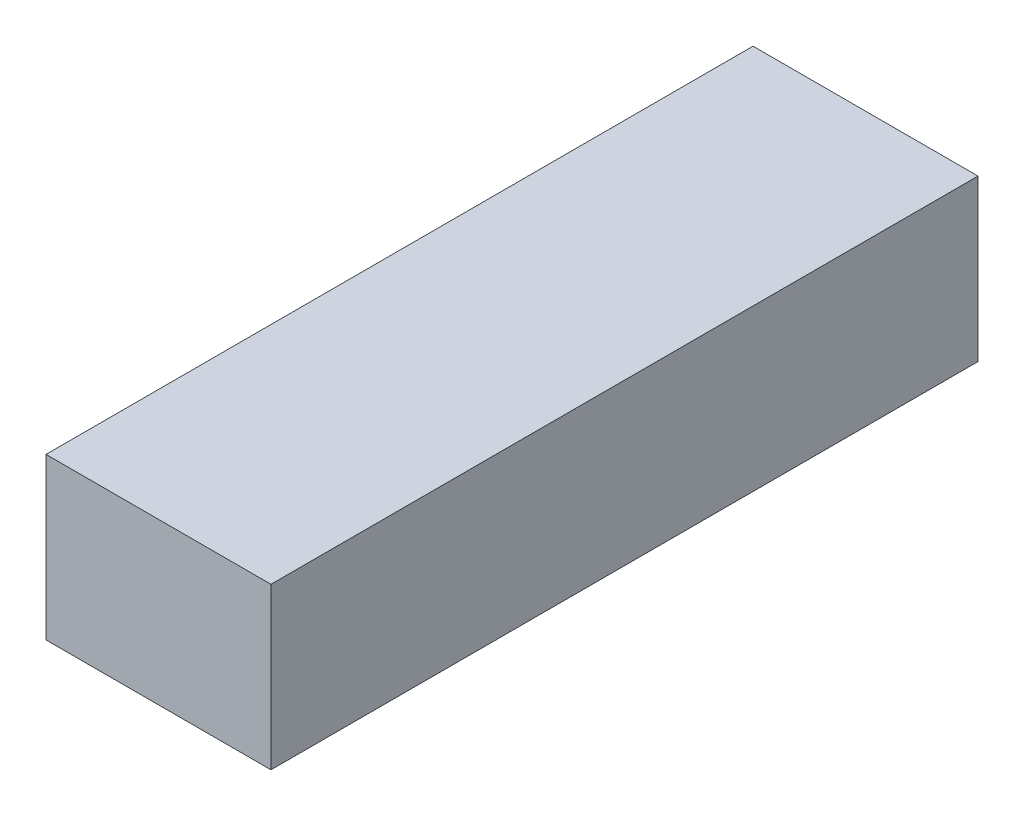
ISO-10303-21;
HEADER;
FILE_DESCRIPTION(('STEP AP214'),'2;1');
FILE_NAME('part.step','',(''),(''),'','','');
FILE_SCHEMA(('AUTOMOTIVE_DESIGN { 1 0 10303 214 1 1 1 1 }'));
ENDSEC;
DATA;
#1=APPLICATION_CONTEXT('core data for automotive mechanical design processes');
#2=APPLICATION_PROTOCOL_DEFINITION('international standard','automotive_design',2000,#1);
#3=PRODUCT_CONTEXT('',#1,'mechanical');
#4=PRODUCT('Part','Part','',(#3));
#5=PRODUCT_RELATED_PRODUCT_CATEGORY('part','',(#4));
#6=PRODUCT_DEFINITION_FORMATION('','',#4);
#7=PRODUCT_DEFINITION_CONTEXT('part definition',#1,'design');
#8=PRODUCT_DEFINITION('design','',#6,#7);
#9=PRODUCT_DEFINITION_SHAPE('','',#8);
#10=(LENGTH_UNIT() NAMED_UNIT(*) SI_UNIT(.MILLI.,.METRE.));
#11=(NAMED_UNIT(*) PLANE_ANGLE_UNIT() SI_UNIT($,.RADIAN.));
#12=(NAMED_UNIT(*) SI_UNIT($,.STERADIAN.) SOLID_ANGLE_UNIT());
#13=UNCERTAINTY_MEASURE_WITH_UNIT(LENGTH_MEASURE(1.E-05),#10,'distance_accuracy_value','');
#14=(GEOMETRIC_REPRESENTATION_CONTEXT(3) GLOBAL_UNCERTAINTY_ASSIGNED_CONTEXT((#13)) GLOBAL_UNIT_ASSIGNED_CONTEXT((#10,
#11,#12)) REPRESENTATION_CONTEXT('',''));
#15=CARTESIAN_POINT('',(0.,0.,0.));
#16=DIRECTION('',(0.,0.,1.));
#17=DIRECTION('',(1.,0.,0.));
#18=AXIS2_PLACEMENT_3D('',#15,#16,#17);
#19=CARTESIAN_POINT('',(-22.225,31.75,-69.85));
#20=DIRECTION('',(1.,0.,0.));
#21=DIRECTION('',(0.,0.,-1.));
#22=AXIS2_PLACEMENT_3D('',#19,#20,#21);
#23=PLANE('',#22);
#24=DIRECTION('',(0.,0.,1.));
#25=VECTOR('',#24,1.);
#26=CARTESIAN_POINT('',(-22.225,0.,-69.85));
#27=LINE('',#26,#25);
#28=CARTESIAN_POINT('',(-22.225,0.,-69.85));
#29=VERTEX_POINT('',#28);
#30=CARTESIAN_POINT('',(-22.225,0.,69.85));
#31=VERTEX_POINT('',#30);
#32=EDGE_CURVE('E107',#29,#31,#27,.T.);
#33=ORIENTED_EDGE('',*,*,#32,.T.);
#34=DIRECTION('',(0.,-1.,0.));
#35=VECTOR('',#34,1.);
#36=CARTESIAN_POINT('',(-22.225,31.75,69.85));
#37=LINE('',#36,#35);
#38=CARTESIAN_POINT('',(-22.225,31.75,69.85));
#39=VERTEX_POINT('',#38);
#40=EDGE_CURVE('E11',#39,#31,#37,.T.);
#41=ORIENTED_EDGE('',*,*,#40,.F.);
#42=DIRECTION('',(0.,0.,1.));
#43=VECTOR('',#42,1.);
#44=CARTESIAN_POINT('',(-22.225,31.75,-69.85));
#45=LINE('',#44,#43);
#46=CARTESIAN_POINT('',(-22.225,31.75,-69.85));
#47=VERTEX_POINT('',#46);
#48=EDGE_CURVE('E91',#47,#39,#45,.T.);
#49=ORIENTED_EDGE('',*,*,#48,.F.);
#50=DIRECTION('',(0.,-1.,0.));
#51=VECTOR('',#50,1.);
#52=CARTESIAN_POINT('',(-22.225,31.75,-69.85));
#53=LINE('',#52,#51);
#54=EDGE_CURVE('E103',#47,#29,#53,.T.);
#55=ORIENTED_EDGE('',*,*,#54,.T.);
#56=EDGE_LOOP('',(#33,#41,#49,#55));
#57=FACE_BOUND('',#56,.T.);
#58=ADVANCED_FACE('F39',(#57),#23,.F.);
#59=CARTESIAN_POINT('',(-22.225,31.75,69.85));
#60=DIRECTION('',(0.,0.,-1.));
#61=DIRECTION('',(-1.,0.,0.));
#62=AXIS2_PLACEMENT_3D('',#59,#60,#61);
#63=PLANE('',#62);
#64=DIRECTION('',(1.,0.,0.));
#65=VECTOR('',#64,1.);
#66=CARTESIAN_POINT('',(-22.225,0.,69.85));
#67=LINE('',#66,#65);
#68=CARTESIAN_POINT('',(22.225,0.,69.85));
#69=VERTEX_POINT('',#68);
#70=EDGE_CURVE('E96',#31,#69,#67,.T.);
#71=ORIENTED_EDGE('',*,*,#70,.T.);
#72=DIRECTION('',(0.,-1.,0.));
#73=VECTOR('',#72,1.);
#74=CARTESIAN_POINT('',(22.225,31.75,69.85));
#75=LINE('',#74,#73);
#76=CARTESIAN_POINT('',(22.225,31.75,69.85));
#77=VERTEX_POINT('',#76);
#78=EDGE_CURVE('E48',#77,#69,#75,.T.);
#79=ORIENTED_EDGE('',*,*,#78,.F.);
#80=DIRECTION('',(1.,0.,0.));
#81=VECTOR('',#80,1.);
#82=CARTESIAN_POINT('',(-22.225,31.75,69.85));
#83=LINE('',#82,#81);
#84=EDGE_CURVE('E86',#39,#77,#83,.T.);
#85=ORIENTED_EDGE('',*,*,#84,.F.);
#86=ORIENTED_EDGE('',*,*,#40,.T.);
#87=EDGE_LOOP('',(#71,#79,#85,#86));
#88=FACE_BOUND('',#87,.T.);
#89=ADVANCED_FACE('F95',(#88),#63,.F.);
#90=CARTESIAN_POINT('',(22.225,31.75,-69.85));
#91=DIRECTION('',(-1.,0.,0.));
#92=DIRECTION('',(0.,0.,1.));
#93=AXIS2_PLACEMENT_3D('',#90,#91,#92);
#94=PLANE('',#93);
#95=DIRECTION('',(0.,0.,-1.));
#96=VECTOR('',#95,1.);
#97=CARTESIAN_POINT('',(22.225,0.,-69.85));
#98=LINE('',#97,#96);
#99=CARTESIAN_POINT('',(22.225,0.,-69.85));
#100=VERTEX_POINT('',#99);
#101=EDGE_CURVE('E73',#69,#100,#98,.T.);
#102=ORIENTED_EDGE('',*,*,#101,.T.);
#103=DIRECTION('',(0.,-1.,0.));
#104=VECTOR('',#103,1.);
#105=CARTESIAN_POINT('',(22.225,31.75,-69.85));
#106=LINE('',#105,#104);
#107=CARTESIAN_POINT('',(22.225,31.75,-69.85));
#108=VERTEX_POINT('',#107);
#109=EDGE_CURVE('E98',#108,#100,#106,.T.);
#110=ORIENTED_EDGE('',*,*,#109,.F.);
#111=DIRECTION('',(0.,0.,-1.));
#112=VECTOR('',#111,1.);
#113=CARTESIAN_POINT('',(22.225,31.75,-69.85));
#114=LINE('',#113,#112);
#115=EDGE_CURVE('E89',#77,#108,#114,.T.);
#116=ORIENTED_EDGE('',*,*,#115,.F.);
#117=ORIENTED_EDGE('',*,*,#78,.T.);
#118=EDGE_LOOP('',(#102,#110,#116,#117));
#119=FACE_BOUND('',#118,.T.);
#120=ADVANCED_FACE('F99',(#119),#94,.F.);
#121=CARTESIAN_POINT('',(-22.225,31.75,-69.85));
#122=DIRECTION('',(0.,0.,1.));
#123=DIRECTION('',(1.,0.,0.));
#124=AXIS2_PLACEMENT_3D('',#121,#122,#123);
#125=PLANE('',#124);
#126=DIRECTION('',(-1.,0.,0.));
#127=VECTOR('',#126,1.);
#128=CARTESIAN_POINT('',(-22.225,0.,-69.85));
#129=LINE('',#128,#127);
#130=EDGE_CURVE('E79',#100,#29,#129,.T.);
#131=ORIENTED_EDGE('',*,*,#130,.T.);
#132=ORIENTED_EDGE('',*,*,#54,.F.);
#133=DIRECTION('',(-1.,0.,0.));
#134=VECTOR('',#133,1.);
#135=CARTESIAN_POINT('',(-22.225,31.75,-69.85));
#136=LINE('',#135,#134);
#137=EDGE_CURVE('E56',#108,#47,#136,.T.);
#138=ORIENTED_EDGE('',*,*,#137,.F.);
#139=ORIENTED_EDGE('',*,*,#109,.T.);
#140=EDGE_LOOP('',(#131,#132,#138,#139));
#141=FACE_BOUND('',#140,.T.);
#142=ADVANCED_FACE('F120',(#141),#125,.F.);
#143=CARTESIAN_POINT('',(0.,31.75,0.));
#144=DIRECTION('',(0.,1.,0.));
#145=DIRECTION('',(0.,0.,1.));
#146=AXIS2_PLACEMENT_3D('',#143,#144,#145);
#147=PLANE('',#146);
#148=ORIENTED_EDGE('',*,*,#48,.T.);
#149=ORIENTED_EDGE('',*,*,#84,.T.);
#150=ORIENTED_EDGE('',*,*,#115,.T.);
#151=ORIENTED_EDGE('',*,*,#137,.T.);
#152=EDGE_LOOP('',(#148,#149,#150,#151));
#153=FACE_BOUND('',#152,.T.);
#154=ADVANCED_FACE('F87',(#153),#147,.T.);
#155=CARTESIAN_POINT('',(0.,0.,0.));
#156=DIRECTION('',(0.,1.,0.));
#157=DIRECTION('',(0.,0.,1.));
#158=AXIS2_PLACEMENT_3D('',#155,#156,#157);
#159=PLANE('',#158);
#160=ORIENTED_EDGE('',*,*,#32,.F.);
#161=ORIENTED_EDGE('',*,*,#130,.F.);
#162=ORIENTED_EDGE('',*,*,#101,.F.);
#163=ORIENTED_EDGE('',*,*,#70,.F.);
#164=EDGE_LOOP('',(#160,#161,#162,#163));
#165=FACE_BOUND('',#164,.T.);
#166=ADVANCED_FACE('F123',(#165),#159,.F.);
#167=CLOSED_SHELL('',(#58,#89,#120,#142,#154,#166));
#168=MANIFOLD_SOLID_BREP('B2',#167);
#169=ADVANCED_BREP_SHAPE_REPRESENTATION('',(#18,#168),#14);
#170=SHAPE_DEFINITION_REPRESENTATION(#9,#169);
ENDSEC;
END-ISO-10303-21;
